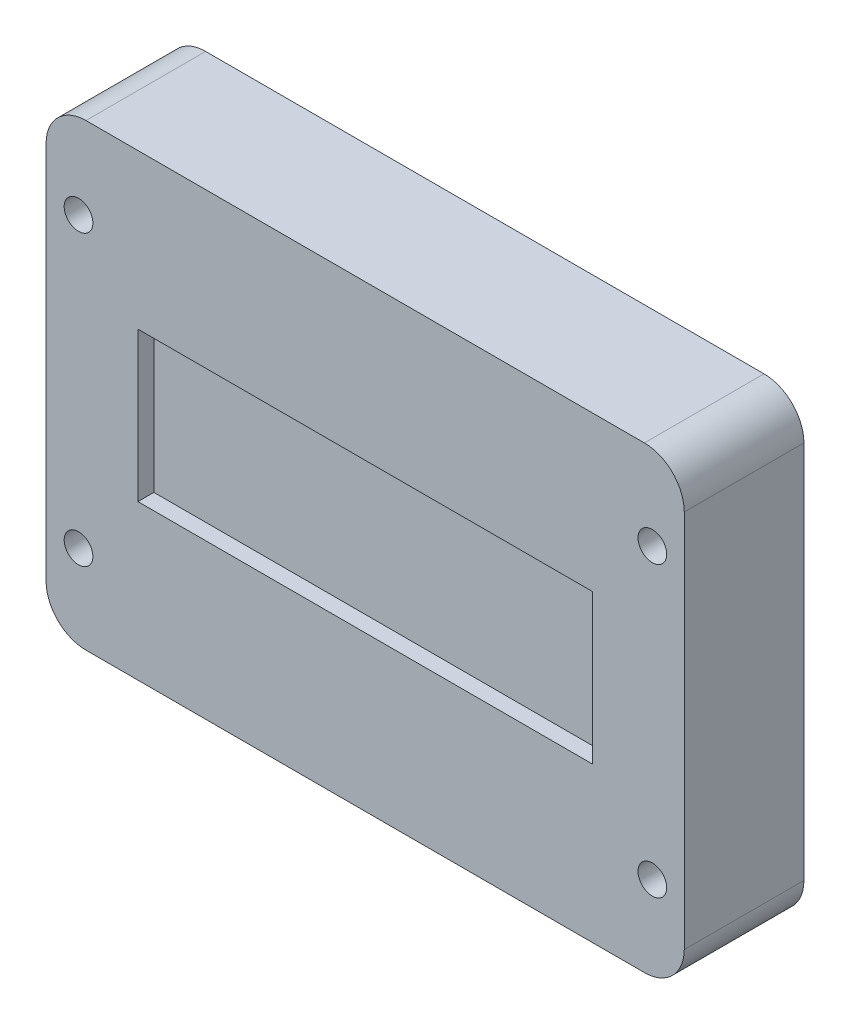
ISO-10303-21;
HEADER;
FILE_DESCRIPTION(('STEP AP214'),'2;1');
FILE_NAME('part.step','',(''),(''),'','','');
FILE_SCHEMA(('AUTOMOTIVE_DESIGN { 1 0 10303 214 1 1 1 1 }'));
ENDSEC;
DATA;
#1=APPLICATION_CONTEXT('core data for automotive mechanical design processes');
#2=APPLICATION_PROTOCOL_DEFINITION('international standard','automotive_design',2000,#1);
#3=PRODUCT_CONTEXT('',#1,'mechanical');
#4=PRODUCT('Part','Part','',(#3));
#5=PRODUCT_RELATED_PRODUCT_CATEGORY('part','',(#4));
#6=PRODUCT_DEFINITION_FORMATION('','',#4);
#7=PRODUCT_DEFINITION_CONTEXT('part definition',#1,'design');
#8=PRODUCT_DEFINITION('design','',#6,#7);
#9=PRODUCT_DEFINITION_SHAPE('','',#8);
#10=(LENGTH_UNIT() NAMED_UNIT(*) SI_UNIT(.MILLI.,.METRE.));
#11=(NAMED_UNIT(*) PLANE_ANGLE_UNIT() SI_UNIT($,.RADIAN.));
#12=(NAMED_UNIT(*) SI_UNIT($,.STERADIAN.) SOLID_ANGLE_UNIT());
#13=UNCERTAINTY_MEASURE_WITH_UNIT(LENGTH_MEASURE(1.E-05),#10,'distance_accuracy_value','');
#14=(GEOMETRIC_REPRESENTATION_CONTEXT(3) GLOBAL_UNCERTAINTY_ASSIGNED_CONTEXT((#13)) GLOBAL_UNIT_ASSIGNED_CONTEXT((#10,
#11,#12)) REPRESENTATION_CONTEXT('',''));
#15=CARTESIAN_POINT('',(0.,0.,0.));
#16=DIRECTION('',(0.,0.,1.));
#17=DIRECTION('',(1.,0.,0.));
#18=AXIS2_PLACEMENT_3D('',#15,#16,#17);
#19=CARTESIAN_POINT('',(44.45,30.1625,19.05));
#20=DIRECTION('',(0.,0.,-1.));
#21=DIRECTION('',(-1.,0.,0.));
#22=AXIS2_PLACEMENT_3D('',#19,#20,#21);
#23=PLANE('',#22);
#24=DIRECTION('',(-1.,0.,0.));
#25=VECTOR('',#24,1.);
#26=CARTESIAN_POINT('',(-36.1754446111462,11.8927769704891,19.05));
#27=LINE('',#26,#25);
#28=CARTESIAN_POINT('',(36.1754446111462,11.8927769704891,19.05));
#29=VERTEX_POINT('',#28);
#30=CARTESIAN_POINT('',(-36.1754446111462,11.8927769704891,19.05));
#31=VERTEX_POINT('',#30);
#32=EDGE_CURVE('E233',#29,#31,#27,.T.);
#33=ORIENTED_EDGE('',*,*,#32,.F.);
#34=DIRECTION('',(0.,1.,0.));
#35=VECTOR('',#34,1.);
#36=CARTESIAN_POINT('',(36.1754446111462,-11.8927769704891,19.05));
#37=LINE('',#36,#35);
#38=CARTESIAN_POINT('',(36.1754446111462,-11.8927769704891,19.05));
#39=VERTEX_POINT('',#38);
#40=EDGE_CURVE('E48',#39,#29,#37,.T.);
#41=ORIENTED_EDGE('',*,*,#40,.F.);
#42=DIRECTION('',(1.,0.,0.));
#43=VECTOR('',#42,1.);
#44=CARTESIAN_POINT('',(-36.1754446111462,-11.8927769704891,19.05));
#45=LINE('',#44,#43);
#46=CARTESIAN_POINT('',(-36.1754446111462,-11.8927769704891,19.05));
#47=VERTEX_POINT('',#46);
#48=EDGE_CURVE('E226',#47,#39,#45,.T.);
#49=ORIENTED_EDGE('',*,*,#48,.F.);
#50=DIRECTION('',(0.,-1.,0.));
#51=VECTOR('',#50,1.);
#52=CARTESIAN_POINT('',(-36.1754446111462,-11.8927769704891,19.05));
#53=LINE('',#52,#51);
#54=EDGE_CURVE('E230',#31,#47,#53,.T.);
#55=ORIENTED_EDGE('',*,*,#54,.F.);
#56=EDGE_LOOP('',(#33,#41,#49,#55));
#57=FACE_BOUND('',#56,.T.);
#58=CARTESIAN_POINT('',(45.72,-23.0505,19.05));
#59=DIRECTION('',(0.,0.,1.));
#60=DIRECTION('',(1.,0.,0.));
#61=AXIS2_PLACEMENT_3D('',#58,#59,#60);
#62=CIRCLE('',#61,2.28599999999999);
#63=CARTESIAN_POINT('',(43.434,-23.0505,19.05));
#64=VERTEX_POINT('',#63);
#65=EDGE_CURVE('E201',#64,#64,#62,.T.);
#66=ORIENTED_EDGE('',*,*,#65,.F.);
#67=EDGE_LOOP('',(#66));
#68=FACE_BOUND('',#67,.T.);
#69=CARTESIAN_POINT('',(-45.6320542440492,22.9235,19.05));
#70=DIRECTION('',(0.,0.,1.));
#71=DIRECTION('',(1.,0.,0.));
#72=AXIS2_PLACEMENT_3D('',#69,#70,#71);
#73=CIRCLE('',#72,2.28599999999999);
#74=CARTESIAN_POINT('',(-47.9180542440492,22.9235,19.05));
#75=VERTEX_POINT('',#74);
#76=EDGE_CURVE('E146',#75,#75,#73,.T.);
#77=ORIENTED_EDGE('',*,*,#76,.F.);
#78=EDGE_LOOP('',(#77));
#79=FACE_BOUND('',#78,.T.);
#80=CARTESIAN_POINT('',(44.45,30.1625,19.05));
#81=DIRECTION('',(0.,0.,1.));
#82=DIRECTION('',(-1.,0.,0.));
#83=AXIS2_PLACEMENT_3D('',#80,#81,#82);
#84=CIRCLE('',#83,6.35);
#85=CARTESIAN_POINT('',(50.8,30.1625,19.05));
#86=VERTEX_POINT('',#85);
#87=CARTESIAN_POINT('',(44.45,36.5125,19.05));
#88=VERTEX_POINT('',#87);
#89=EDGE_CURVE('E158',#86,#88,#84,.T.);
#90=ORIENTED_EDGE('',*,*,#89,.T.);
#91=DIRECTION('',(-1.,0.,0.));
#92=VECTOR('',#91,1.);
#93=CARTESIAN_POINT('',(-44.4499999999999,36.5125,19.05));
#94=LINE('',#93,#92);
#95=CARTESIAN_POINT('',(-44.4499999999999,36.5125,19.05));
#96=VERTEX_POINT('',#95);
#97=EDGE_CURVE('E98',#88,#96,#94,.T.);
#98=ORIENTED_EDGE('',*,*,#97,.T.);
#99=CARTESIAN_POINT('',(-44.45,30.1625,19.05));
#100=DIRECTION('',(0.,0.,1.));
#101=DIRECTION('',(-1.,0.,0.));
#102=AXIS2_PLACEMENT_3D('',#99,#100,#101);
#103=CIRCLE('',#102,6.35);
#104=CARTESIAN_POINT('',(-50.8,30.1625,19.05));
#105=VERTEX_POINT('',#104);
#106=EDGE_CURVE('E173',#96,#105,#103,.T.);
#107=ORIENTED_EDGE('',*,*,#106,.T.);
#108=DIRECTION('',(0.,-1.,0.));
#109=VECTOR('',#108,1.);
#110=CARTESIAN_POINT('',(-50.8,-30.1624999999999,19.05));
#111=LINE('',#110,#109);
#112=CARTESIAN_POINT('',(-50.8,-30.1624999999999,19.05));
#113=VERTEX_POINT('',#112);
#114=EDGE_CURVE('E186',#105,#113,#111,.T.);
#115=ORIENTED_EDGE('',*,*,#114,.T.);
#116=CARTESIAN_POINT('',(-44.45,-30.1625,19.05));
#117=DIRECTION('',(0.,0.,1.));
#118=DIRECTION('',(1.,0.,0.));
#119=AXIS2_PLACEMENT_3D('',#116,#117,#118);
#120=CIRCLE('',#119,6.35);
#121=CARTESIAN_POINT('',(-44.4499999999999,-36.5125,19.05));
#122=VERTEX_POINT('',#121);
#123=EDGE_CURVE('E121',#113,#122,#120,.T.);
#124=ORIENTED_EDGE('',*,*,#123,.T.);
#125=DIRECTION('',(1.,0.,0.));
#126=VECTOR('',#125,1.);
#127=CARTESIAN_POINT('',(-44.4499999999999,-36.5125,19.05));
#128=LINE('',#127,#126);
#129=CARTESIAN_POINT('',(44.45,-36.5125,19.05));
#130=VERTEX_POINT('',#129);
#131=EDGE_CURVE('E114',#122,#130,#128,.T.);
#132=ORIENTED_EDGE('',*,*,#131,.T.);
#133=CARTESIAN_POINT('',(44.45,-30.1625,19.05));
#134=DIRECTION('',(0.,0.,1.));
#135=DIRECTION('',(-1.,0.,0.));
#136=AXIS2_PLACEMENT_3D('',#133,#134,#135);
#137=CIRCLE('',#136,6.35);
#138=CARTESIAN_POINT('',(50.8,-30.1624999999999,19.05));
#139=VERTEX_POINT('',#138);
#140=EDGE_CURVE('E118',#130,#139,#137,.T.);
#141=ORIENTED_EDGE('',*,*,#140,.T.);
#142=DIRECTION('',(0.,1.,0.));
#143=VECTOR('',#142,1.);
#144=CARTESIAN_POINT('',(50.8,-30.1624999999999,19.05));
#145=LINE('',#144,#143);
#146=EDGE_CURVE('E57',#139,#86,#145,.T.);
#147=ORIENTED_EDGE('',*,*,#146,.T.);
#148=EDGE_LOOP('',(#90,#98,#107,#115,#124,#132,#141,#147));
#149=FACE_BOUND('',#148,.T.);
#150=CARTESIAN_POINT('',(45.72,22.9235,19.05));
#151=DIRECTION('',(0.,0.,1.));
#152=DIRECTION('',(1.,0.,0.));
#153=AXIS2_PLACEMENT_3D('',#150,#151,#152);
#154=CIRCLE('',#153,2.28599999999999);
#155=CARTESIAN_POINT('',(43.434,22.9235,19.05));
#156=VERTEX_POINT('',#155);
#157=EDGE_CURVE('E195',#156,#156,#154,.T.);
#158=ORIENTED_EDGE('',*,*,#157,.F.);
#159=EDGE_LOOP('',(#158));
#160=FACE_BOUND('',#159,.T.);
#161=CARTESIAN_POINT('',(-45.6320542440492,-23.0505,19.05));
#162=DIRECTION('',(0.,0.,1.));
#163=DIRECTION('',(1.,0.,0.));
#164=AXIS2_PLACEMENT_3D('',#161,#162,#163);
#165=CIRCLE('',#164,2.28599999999999);
#166=CARTESIAN_POINT('',(-47.9180542440492,-23.0505,19.05));
#167=VERTEX_POINT('',#166);
#168=EDGE_CURVE('E207',#167,#167,#165,.T.);
#169=ORIENTED_EDGE('',*,*,#168,.F.);
#170=EDGE_LOOP('',(#169));
#171=FACE_BOUND('',#170,.T.);
#172=ADVANCED_FACE('F33',(#57,#68,#79,#149,#160,#171),#23,.F.);
#173=CARTESIAN_POINT('',(44.45,30.1625,0.));
#174=DIRECTION('',(0.,0.,-1.));
#175=DIRECTION('',(-1.,0.,0.));
#176=AXIS2_PLACEMENT_3D('',#173,#174,#175);
#177=PLANE('',#176);
#178=CARTESIAN_POINT('',(45.72,-23.0505,0.));
#179=DIRECTION('',(0.,0.,1.));
#180=DIRECTION('',(1.,0.,0.));
#181=AXIS2_PLACEMENT_3D('',#178,#179,#180);
#182=CIRCLE('',#181,2.28599999999999);
#183=CARTESIAN_POINT('',(43.434,-23.0505,0.));
#184=VERTEX_POINT('',#183);
#185=EDGE_CURVE('E204',#184,#184,#182,.T.);
#186=ORIENTED_EDGE('',*,*,#185,.T.);
#187=EDGE_LOOP('',(#186));
#188=FACE_BOUND('',#187,.T.);
#189=CARTESIAN_POINT('',(-45.6320542440492,22.9235,0.));
#190=DIRECTION('',(0.,0.,1.));
#191=DIRECTION('',(1.,0.,0.));
#192=AXIS2_PLACEMENT_3D('',#189,#190,#191);
#193=CIRCLE('',#192,2.28599999999999);
#194=CARTESIAN_POINT('',(-47.9180542440492,22.9235,0.));
#195=VERTEX_POINT('',#194);
#196=EDGE_CURVE('E192',#195,#195,#193,.T.);
#197=ORIENTED_EDGE('',*,*,#196,.T.);
#198=EDGE_LOOP('',(#197));
#199=FACE_BOUND('',#198,.T.);
#200=CARTESIAN_POINT('',(44.45,30.1625,0.));
#201=DIRECTION('',(0.,0.,1.));
#202=DIRECTION('',(-1.,0.,0.));
#203=AXIS2_PLACEMENT_3D('',#200,#201,#202);
#204=CIRCLE('',#203,6.35);
#205=CARTESIAN_POINT('',(50.8,30.1625,0.));
#206=VERTEX_POINT('',#205);
#207=CARTESIAN_POINT('',(44.45,36.5125,0.));
#208=VERTEX_POINT('',#207);
#209=EDGE_CURVE('E142',#206,#208,#204,.T.);
#210=ORIENTED_EDGE('',*,*,#209,.F.);
#211=DIRECTION('',(0.,1.,0.));
#212=VECTOR('',#211,1.);
#213=CARTESIAN_POINT('',(50.8,-30.1624999999999,0.));
#214=LINE('',#213,#212);
#215=CARTESIAN_POINT('',(50.8,-30.1624999999999,0.));
#216=VERTEX_POINT('',#215);
#217=EDGE_CURVE('E90',#216,#206,#214,.T.);
#218=ORIENTED_EDGE('',*,*,#217,.F.);
#219=CARTESIAN_POINT('',(44.45,-30.1625,0.));
#220=DIRECTION('',(0.,0.,1.));
#221=DIRECTION('',(-1.,0.,0.));
#222=AXIS2_PLACEMENT_3D('',#219,#220,#221);
#223=CIRCLE('',#222,6.35);
#224=CARTESIAN_POINT('',(44.45,-36.5125,0.));
#225=VERTEX_POINT('',#224);
#226=EDGE_CURVE('E155',#225,#216,#223,.T.);
#227=ORIENTED_EDGE('',*,*,#226,.F.);
#228=DIRECTION('',(1.,0.,0.));
#229=VECTOR('',#228,1.);
#230=CARTESIAN_POINT('',(-44.4499999999999,-36.5125,0.));
#231=LINE('',#230,#229);
#232=CARTESIAN_POINT('',(-44.4499999999999,-36.5125,0.));
#233=VERTEX_POINT('',#232);
#234=EDGE_CURVE('E130',#233,#225,#231,.T.);
#235=ORIENTED_EDGE('',*,*,#234,.F.);
#236=CARTESIAN_POINT('',(-44.45,-30.1625,0.));
#237=DIRECTION('',(0.,0.,1.));
#238=DIRECTION('',(1.,0.,0.));
#239=AXIS2_PLACEMENT_3D('',#236,#237,#238);
#240=CIRCLE('',#239,6.35);
#241=CARTESIAN_POINT('',(-50.8,-30.1624999999999,0.));
#242=VERTEX_POINT('',#241);
#243=EDGE_CURVE('E152',#242,#233,#240,.T.);
#244=ORIENTED_EDGE('',*,*,#243,.F.);
#245=DIRECTION('',(0.,-1.,0.));
#246=VECTOR('',#245,1.);
#247=CARTESIAN_POINT('',(-50.8,-30.1624999999999,0.));
#248=LINE('',#247,#246);
#249=CARTESIAN_POINT('',(-50.8,30.1625,0.));
#250=VERTEX_POINT('',#249);
#251=EDGE_CURVE('E150',#250,#242,#248,.T.);
#252=ORIENTED_EDGE('',*,*,#251,.F.);
#253=CARTESIAN_POINT('',(-44.45,30.1625,0.));
#254=DIRECTION('',(0.,0.,1.));
#255=DIRECTION('',(-1.,0.,0.));
#256=AXIS2_PLACEMENT_3D('',#253,#254,#255);
#257=CIRCLE('',#256,6.35);
#258=CARTESIAN_POINT('',(-44.4499999999999,36.5125,0.));
#259=VERTEX_POINT('',#258);
#260=EDGE_CURVE('E148',#259,#250,#257,.T.);
#261=ORIENTED_EDGE('',*,*,#260,.F.);
#262=DIRECTION('',(-1.,0.,0.));
#263=VECTOR('',#262,1.);
#264=CARTESIAN_POINT('',(-44.4499999999999,36.5125,0.));
#265=LINE('',#264,#263);
#266=EDGE_CURVE('E145',#208,#259,#265,.T.);
#267=ORIENTED_EDGE('',*,*,#266,.F.);
#268=EDGE_LOOP('',(#210,#218,#227,#235,#244,#252,#261,#267));
#269=FACE_BOUND('',#268,.T.);
#270=CARTESIAN_POINT('',(45.72,22.9235,0.));
#271=DIRECTION('',(0.,0.,1.));
#272=DIRECTION('',(1.,0.,0.));
#273=AXIS2_PLACEMENT_3D('',#270,#271,#272);
#274=CIRCLE('',#273,2.28599999999999);
#275=CARTESIAN_POINT('',(43.434,22.9235,0.));
#276=VERTEX_POINT('',#275);
#277=EDGE_CURVE('E198',#276,#276,#274,.T.);
#278=ORIENTED_EDGE('',*,*,#277,.T.);
#279=EDGE_LOOP('',(#278));
#280=FACE_BOUND('',#279,.T.);
#281=CARTESIAN_POINT('',(-45.6320542440492,-23.0505,0.));
#282=DIRECTION('',(0.,0.,1.));
#283=DIRECTION('',(1.,0.,0.));
#284=AXIS2_PLACEMENT_3D('',#281,#282,#283);
#285=CIRCLE('',#284,2.28599999999999);
#286=CARTESIAN_POINT('',(-47.9180542440492,-23.0505,0.));
#287=VERTEX_POINT('',#286);
#288=EDGE_CURVE('E210',#287,#287,#285,.T.);
#289=ORIENTED_EDGE('',*,*,#288,.T.);
#290=EDGE_LOOP('',(#289));
#291=FACE_BOUND('',#290,.T.);
#292=ADVANCED_FACE('F177',(#188,#199,#269,#280,#291),#177,.T.);
#293=CARTESIAN_POINT('',(44.45,30.1625,19.05));
#294=DIRECTION('',(0.,0.,-1.));
#295=DIRECTION('',(-1.,0.,0.));
#296=AXIS2_PLACEMENT_3D('',#293,#294,#295);
#297=CYLINDRICAL_SURFACE('',#296,6.35);
#298=ORIENTED_EDGE('',*,*,#209,.T.);
#299=DIRECTION('',(0.,0.,-1.));
#300=VECTOR('',#299,1.);
#301=CARTESIAN_POINT('',(44.45,36.5125,19.05));
#302=LINE('',#301,#300);
#303=EDGE_CURVE('E11',#88,#208,#302,.T.);
#304=ORIENTED_EDGE('',*,*,#303,.F.);
#305=ORIENTED_EDGE('',*,*,#89,.F.);
#306=DIRECTION('',(0.,0.,-1.));
#307=VECTOR('',#306,1.);
#308=CARTESIAN_POINT('',(50.8,30.1625,19.05));
#309=LINE('',#308,#307);
#310=EDGE_CURVE('E138',#86,#206,#309,.T.);
#311=ORIENTED_EDGE('',*,*,#310,.T.);
#312=EDGE_LOOP('',(#298,#304,#305,#311));
#313=FACE_BOUND('',#312,.T.);
#314=ADVANCED_FACE('F35',(#313),#297,.T.);
#315=CARTESIAN_POINT('',(-44.4499999999999,36.5125,19.05));
#316=DIRECTION('',(0.,-1.,0.));
#317=DIRECTION('',(0.,0.,-1.));
#318=AXIS2_PLACEMENT_3D('',#315,#316,#317);
#319=PLANE('',#318);
#320=ORIENTED_EDGE('',*,*,#266,.T.);
#321=DIRECTION('',(0.,0.,-1.));
#322=VECTOR('',#321,1.);
#323=CARTESIAN_POINT('',(-44.4499999999999,36.5125,19.05));
#324=LINE('',#323,#322);
#325=EDGE_CURVE('E41',#96,#259,#324,.T.);
#326=ORIENTED_EDGE('',*,*,#325,.F.);
#327=ORIENTED_EDGE('',*,*,#97,.F.);
#328=ORIENTED_EDGE('',*,*,#303,.T.);
#329=EDGE_LOOP('',(#320,#326,#327,#328));
#330=FACE_BOUND('',#329,.T.);
#331=ADVANCED_FACE('F311',(#330),#319,.F.);
#332=CARTESIAN_POINT('',(-44.45,30.1625,19.05));
#333=DIRECTION('',(0.,0.,-1.));
#334=DIRECTION('',(-1.,0.,0.));
#335=AXIS2_PLACEMENT_3D('',#332,#333,#334);
#336=CYLINDRICAL_SURFACE('',#335,6.35);
#337=ORIENTED_EDGE('',*,*,#260,.T.);
#338=DIRECTION('',(0.,0.,-1.));
#339=VECTOR('',#338,1.);
#340=CARTESIAN_POINT('',(-50.8,30.1625,19.05));
#341=LINE('',#340,#339);
#342=EDGE_CURVE('E165',#105,#250,#341,.T.);
#343=ORIENTED_EDGE('',*,*,#342,.F.);
#344=ORIENTED_EDGE('',*,*,#106,.F.);
#345=ORIENTED_EDGE('',*,*,#325,.T.);
#346=EDGE_LOOP('',(#337,#343,#344,#345));
#347=FACE_BOUND('',#346,.T.);
#348=ADVANCED_FACE('F171',(#347),#336,.T.);
#349=CARTESIAN_POINT('',(-50.8,-30.1624999999999,19.05));
#350=DIRECTION('',(1.,0.,0.));
#351=DIRECTION('',(0.,0.,-1.));
#352=AXIS2_PLACEMENT_3D('',#349,#350,#351);
#353=PLANE('',#352);
#354=ORIENTED_EDGE('',*,*,#251,.T.);
#355=DIRECTION('',(0.,0.,-1.));
#356=VECTOR('',#355,1.);
#357=CARTESIAN_POINT('',(-50.8,-30.1624999999999,19.05));
#358=LINE('',#357,#356);
#359=EDGE_CURVE('E162',#113,#242,#358,.T.);
#360=ORIENTED_EDGE('',*,*,#359,.F.);
#361=ORIENTED_EDGE('',*,*,#114,.F.);
#362=ORIENTED_EDGE('',*,*,#342,.T.);
#363=EDGE_LOOP('',(#354,#360,#361,#362));
#364=FACE_BOUND('',#363,.T.);
#365=ADVANCED_FACE('F182',(#364),#353,.F.);
#366=CARTESIAN_POINT('',(-44.45,-30.1625,19.05));
#367=DIRECTION('',(0.,0.,-1.));
#368=DIRECTION('',(-1.,0.,0.));
#369=AXIS2_PLACEMENT_3D('',#366,#367,#368);
#370=CYLINDRICAL_SURFACE('',#369,6.35);
#371=ORIENTED_EDGE('',*,*,#243,.T.);
#372=DIRECTION('',(0.,0.,-1.));
#373=VECTOR('',#372,1.);
#374=CARTESIAN_POINT('',(-44.4499999999999,-36.5125,19.05));
#375=LINE('',#374,#373);
#376=EDGE_CURVE('E133',#122,#233,#375,.T.);
#377=ORIENTED_EDGE('',*,*,#376,.F.);
#378=ORIENTED_EDGE('',*,*,#123,.F.);
#379=ORIENTED_EDGE('',*,*,#359,.T.);
#380=EDGE_LOOP('',(#371,#377,#378,#379));
#381=FACE_BOUND('',#380,.T.);
#382=ADVANCED_FACE('F185',(#381),#370,.T.);
#383=CARTESIAN_POINT('',(-44.4499999999999,-36.5125,19.05));
#384=DIRECTION('',(0.,1.,0.));
#385=DIRECTION('',(0.,0.,1.));
#386=AXIS2_PLACEMENT_3D('',#383,#384,#385);
#387=PLANE('',#386);
#388=ORIENTED_EDGE('',*,*,#234,.T.);
#389=DIRECTION('',(0.,0.,-1.));
#390=VECTOR('',#389,1.);
#391=CARTESIAN_POINT('',(44.45,-36.5125,19.05));
#392=LINE('',#391,#390);
#393=EDGE_CURVE('E127',#130,#225,#392,.T.);
#394=ORIENTED_EDGE('',*,*,#393,.F.);
#395=ORIENTED_EDGE('',*,*,#131,.F.);
#396=ORIENTED_EDGE('',*,*,#376,.T.);
#397=EDGE_LOOP('',(#388,#394,#395,#396));
#398=FACE_BOUND('',#397,.T.);
#399=ADVANCED_FACE('F128',(#398),#387,.F.);
#400=CARTESIAN_POINT('',(44.45,-30.1625,19.05));
#401=DIRECTION('',(0.,0.,-1.));
#402=DIRECTION('',(-1.,0.,0.));
#403=AXIS2_PLACEMENT_3D('',#400,#401,#402);
#404=CYLINDRICAL_SURFACE('',#403,6.35);
#405=ORIENTED_EDGE('',*,*,#226,.T.);
#406=DIRECTION('',(0.,0.,-1.));
#407=VECTOR('',#406,1.);
#408=CARTESIAN_POINT('',(50.8,-30.1624999999999,19.05));
#409=LINE('',#408,#407);
#410=EDGE_CURVE('E134',#139,#216,#409,.T.);
#411=ORIENTED_EDGE('',*,*,#410,.F.);
#412=ORIENTED_EDGE('',*,*,#140,.F.);
#413=ORIENTED_EDGE('',*,*,#393,.T.);
#414=EDGE_LOOP('',(#405,#411,#412,#413));
#415=FACE_BOUND('',#414,.T.);
#416=ADVANCED_FACE('F136',(#415),#404,.T.);
#417=CARTESIAN_POINT('',(50.8,-30.1624999999999,19.05));
#418=DIRECTION('',(-1.,0.,0.));
#419=DIRECTION('',(0.,0.,1.));
#420=AXIS2_PLACEMENT_3D('',#417,#418,#419);
#421=PLANE('',#420);
#422=ORIENTED_EDGE('',*,*,#217,.T.);
#423=ORIENTED_EDGE('',*,*,#310,.F.);
#424=ORIENTED_EDGE('',*,*,#146,.F.);
#425=ORIENTED_EDGE('',*,*,#410,.T.);
#426=EDGE_LOOP('',(#422,#423,#424,#425));
#427=FACE_BOUND('',#426,.T.);
#428=ADVANCED_FACE('F299',(#427),#421,.F.);
#429=CARTESIAN_POINT('',(-45.6320542440492,22.9235,19.05));
#430=DIRECTION('',(0.,0.,-1.));
#431=DIRECTION('',(-1.,0.,0.));
#432=AXIS2_PLACEMENT_3D('',#429,#430,#431);
#433=CYLINDRICAL_SURFACE('',#432,2.28599999999999);
#434=CARTESIAN_POINT('',(-47.9180542440492,22.9235,19.05));
#435=CARTESIAN_POINT('',(-47.9180542440492,22.9235,18.8515625));
#436=CARTESIAN_POINT('',(-47.9180542440492,22.9235,18.653125));
#437=CARTESIAN_POINT('',(-47.9180542440492,22.9235,18.25625));
#438=CARTESIAN_POINT('',(-47.9180542440492,22.9235,18.0578125));
#439=CARTESIAN_POINT('',(-47.9180542440492,22.9235,17.6609375));
#440=CARTESIAN_POINT('',(-47.9180542440492,22.9235,17.4625));
#441=CARTESIAN_POINT('',(-47.9180542440492,22.9235,17.065625));
#442=CARTESIAN_POINT('',(-47.9180542440492,22.9235,16.8671875));
#443=CARTESIAN_POINT('',(-47.9180542440492,22.9235,16.4703125));
#444=CARTESIAN_POINT('',(-47.9180542440492,22.9235,16.271875));
#445=CARTESIAN_POINT('',(-47.9180542440492,22.9235,15.875));
#446=CARTESIAN_POINT('',(-47.9180542440492,22.9235,15.6765625));
#447=CARTESIAN_POINT('',(-47.9180542440492,22.9235,15.2796875));
#448=CARTESIAN_POINT('',(-47.9180542440492,22.9235,15.08125));
#449=CARTESIAN_POINT('',(-47.9180542440492,22.9235,14.684375));
#450=CARTESIAN_POINT('',(-47.9180542440492,22.9235,14.4859375));
#451=CARTESIAN_POINT('',(-47.9180542440492,22.9235,14.0890625));
#452=CARTESIAN_POINT('',(-47.9180542440492,22.9235,13.890625));
#453=CARTESIAN_POINT('',(-47.9180542440492,22.9235,13.49375));
#454=CARTESIAN_POINT('',(-47.9180542440492,22.9235,13.2953125));
#455=CARTESIAN_POINT('',(-47.9180542440492,22.9235,12.8984375));
#456=CARTESIAN_POINT('',(-47.9180542440492,22.9235,12.7));
#457=CARTESIAN_POINT('',(-47.9180542440492,22.9235,12.303125));
#458=CARTESIAN_POINT('',(-47.9180542440492,22.9235,12.1046875));
#459=CARTESIAN_POINT('',(-47.9180542440492,22.9235,11.7078125));
#460=CARTESIAN_POINT('',(-47.9180542440492,22.9235,11.509375));
#461=CARTESIAN_POINT('',(-47.9180542440492,22.9235,11.1125));
#462=CARTESIAN_POINT('',(-47.9180542440492,22.9235,10.9140625));
#463=CARTESIAN_POINT('',(-47.9180542440492,22.9235,10.5171875));
#464=CARTESIAN_POINT('',(-47.9180542440492,22.9235,10.31875));
#465=CARTESIAN_POINT('',(-47.9180542440492,22.9235,9.921875));
#466=CARTESIAN_POINT('',(-47.9180542440492,22.9235,9.7234375));
#467=CARTESIAN_POINT('',(-47.9180542440492,22.9235,9.3265625));
#468=CARTESIAN_POINT('',(-47.9180542440492,22.9235,9.128125));
#469=CARTESIAN_POINT('',(-47.9180542440492,22.9235,8.73125));
#470=CARTESIAN_POINT('',(-47.9180542440492,22.9235,8.5328125));
#471=CARTESIAN_POINT('',(-47.9180542440492,22.9235,8.1359375));
#472=CARTESIAN_POINT('',(-47.9180542440492,22.9235,7.9375));
#473=CARTESIAN_POINT('',(-47.9180542440492,22.9235,7.540625));
#474=CARTESIAN_POINT('',(-47.9180542440492,22.9235,7.3421875));
#475=CARTESIAN_POINT('',(-47.9180542440492,22.9235,6.9453125));
#476=CARTESIAN_POINT('',(-47.9180542440492,22.9235,6.746875));
#477=CARTESIAN_POINT('',(-47.9180542440492,22.9235,6.35));
#478=CARTESIAN_POINT('',(-47.9180542440492,22.9235,6.1515625));
#479=CARTESIAN_POINT('',(-47.9180542440492,22.9235,5.7546875));
#480=CARTESIAN_POINT('',(-47.9180542440492,22.9235,5.55625));
#481=CARTESIAN_POINT('',(-47.9180542440492,22.9235,5.159375));
#482=CARTESIAN_POINT('',(-47.9180542440492,22.9235,4.9609375));
#483=CARTESIAN_POINT('',(-47.9180542440492,22.9235,4.5640625));
#484=CARTESIAN_POINT('',(-47.9180542440492,22.9235,4.365625));
#485=CARTESIAN_POINT('',(-47.9180542440492,22.9235,3.96875));
#486=CARTESIAN_POINT('',(-47.9180542440492,22.9235,3.7703125));
#487=CARTESIAN_POINT('',(-47.9180542440492,22.9235,3.3734375));
#488=CARTESIAN_POINT('',(-47.9180542440492,22.9235,3.175));
#489=CARTESIAN_POINT('',(-47.9180542440492,22.9235,2.778125));
#490=CARTESIAN_POINT('',(-47.9180542440492,22.9235,2.5796875));
#491=CARTESIAN_POINT('',(-47.9180542440492,22.9235,2.1828125));
#492=CARTESIAN_POINT('',(-47.9180542440492,22.9235,1.984375));
#493=CARTESIAN_POINT('',(-47.9180542440492,22.9235,1.5875));
#494=CARTESIAN_POINT('',(-47.9180542440492,22.9235,1.3890625));
#495=CARTESIAN_POINT('',(-47.9180542440492,22.9235,0.992187500000001));
#496=CARTESIAN_POINT('',(-47.9180542440492,22.9235,0.793750000000001));
#497=CARTESIAN_POINT('',(-47.9180542440492,22.9235,0.396875));
#498=CARTESIAN_POINT('',(-47.9180542440492,22.9235,0.1984375));
#499=CARTESIAN_POINT('',(-47.9180542440492,22.9235,0.));
#500=B_SPLINE_CURVE_WITH_KNOTS('',3,(#434,#435,#436,#437,#438,#439,#440,#441,#442,#443,#444,
#445,#446,#447,#448,#449,#450,#451,#452,#453,#454,#455,#456,#457,#458,#459,#460,#461,#462,#463,
#464,#465,#466,#467,#468,#469,#470,#471,#472,#473,#474,#475,#476,#477,#478,#479,#480,#481,#482,
#483,#484,#485,#486,#487,#488,#489,#490,#491,#492,#493,#494,#495,#496,#497,#498,#499),
.UNSPECIFIED.,.F.,.F.,(4,2,2,2,2,2,2,2,2,2,2,2,2,2,2,2,2,2,2,2,2,2,2,2,2,2,2,2,2,2,2,2,4),(0.,
0.5953125,1.190625,1.7859375,2.38125,2.9765625,3.571875,4.1671875,4.7625,5.3578125,5.953125,
6.5484375,7.14375,7.7390625,8.334375,8.9296875,9.525,10.1203125,10.715625,11.3109375,11.90625,
12.5015625,13.096875,13.6921875,14.2875,14.8828125,15.478125,16.0734375,16.66875,17.2640625,
17.859375,18.4546875,19.05),.UNSPECIFIED.);
#501=EDGE_CURVE('BSEAM296',#75,#195,#500,.T.);
#502=ORIENTED_EDGE('',*,*,#76,.T.);
#503=ORIENTED_EDGE('',*,*,#196,.F.);
#504=ORIENTED_EDGE('',*,*,#501,.T.);
#505=ORIENTED_EDGE('',*,*,#501,.F.);
#506=EDGE_LOOP('',(#502,#504,#503,#505));
#507=FACE_BOUND('',#506,.T.);
#508=ADVANCED_FACE('F296',(#507),#433,.F.);
#509=CARTESIAN_POINT('',(45.72,22.9235,19.05));
#510=DIRECTION('',(0.,0.,-1.));
#511=DIRECTION('',(-1.,0.,0.));
#512=AXIS2_PLACEMENT_3D('',#509,#510,#511);
#513=CYLINDRICAL_SURFACE('',#512,2.28599999999999);
#514=CARTESIAN_POINT('',(43.434,22.9235,19.05));
#515=CARTESIAN_POINT('',(43.434,22.9235,18.8515625));
#516=CARTESIAN_POINT('',(43.434,22.9235,18.653125));
#517=CARTESIAN_POINT('',(43.434,22.9235,18.25625));
#518=CARTESIAN_POINT('',(43.434,22.9235,18.0578125));
#519=CARTESIAN_POINT('',(43.434,22.9235,17.6609375));
#520=CARTESIAN_POINT('',(43.434,22.9235,17.4625));
#521=CARTESIAN_POINT('',(43.434,22.9235,17.065625));
#522=CARTESIAN_POINT('',(43.434,22.9235,16.8671875));
#523=CARTESIAN_POINT('',(43.434,22.9235,16.4703125));
#524=CARTESIAN_POINT('',(43.434,22.9235,16.271875));
#525=CARTESIAN_POINT('',(43.434,22.9235,15.875));
#526=CARTESIAN_POINT('',(43.434,22.9235,15.6765625));
#527=CARTESIAN_POINT('',(43.434,22.9235,15.2796875));
#528=CARTESIAN_POINT('',(43.434,22.9235,15.08125));
#529=CARTESIAN_POINT('',(43.434,22.9235,14.684375));
#530=CARTESIAN_POINT('',(43.434,22.9235,14.4859375));
#531=CARTESIAN_POINT('',(43.434,22.9235,14.0890625));
#532=CARTESIAN_POINT('',(43.434,22.9235,13.890625));
#533=CARTESIAN_POINT('',(43.434,22.9235,13.49375));
#534=CARTESIAN_POINT('',(43.434,22.9235,13.2953125));
#535=CARTESIAN_POINT('',(43.434,22.9235,12.8984375));
#536=CARTESIAN_POINT('',(43.434,22.9235,12.7));
#537=CARTESIAN_POINT('',(43.434,22.9235,12.303125));
#538=CARTESIAN_POINT('',(43.434,22.9235,12.1046875));
#539=CARTESIAN_POINT('',(43.434,22.9235,11.7078125));
#540=CARTESIAN_POINT('',(43.434,22.9235,11.509375));
#541=CARTESIAN_POINT('',(43.434,22.9235,11.1125));
#542=CARTESIAN_POINT('',(43.434,22.9235,10.9140625));
#543=CARTESIAN_POINT('',(43.434,22.9235,10.5171875));
#544=CARTESIAN_POINT('',(43.434,22.9235,10.31875));
#545=CARTESIAN_POINT('',(43.434,22.9235,9.921875));
#546=CARTESIAN_POINT('',(43.434,22.9235,9.7234375));
#547=CARTESIAN_POINT('',(43.434,22.9235,9.3265625));
#548=CARTESIAN_POINT('',(43.434,22.9235,9.128125));
#549=CARTESIAN_POINT('',(43.434,22.9235,8.73125));
#550=CARTESIAN_POINT('',(43.434,22.9235,8.5328125));
#551=CARTESIAN_POINT('',(43.434,22.9235,8.1359375));
#552=CARTESIAN_POINT('',(43.434,22.9235,7.9375));
#553=CARTESIAN_POINT('',(43.434,22.9235,7.540625));
#554=CARTESIAN_POINT('',(43.434,22.9235,7.3421875));
#555=CARTESIAN_POINT('',(43.434,22.9235,6.9453125));
#556=CARTESIAN_POINT('',(43.434,22.9235,6.746875));
#557=CARTESIAN_POINT('',(43.434,22.9235,6.35));
#558=CARTESIAN_POINT('',(43.434,22.9235,6.1515625));
#559=CARTESIAN_POINT('',(43.434,22.9235,5.7546875));
#560=CARTESIAN_POINT('',(43.434,22.9235,5.55625));
#561=CARTESIAN_POINT('',(43.434,22.9235,5.159375));
#562=CARTESIAN_POINT('',(43.434,22.9235,4.9609375));
#563=CARTESIAN_POINT('',(43.434,22.9235,4.5640625));
#564=CARTESIAN_POINT('',(43.434,22.9235,4.365625));
#565=CARTESIAN_POINT('',(43.434,22.9235,3.96875));
#566=CARTESIAN_POINT('',(43.434,22.9235,3.7703125));
#567=CARTESIAN_POINT('',(43.434,22.9235,3.3734375));
#568=CARTESIAN_POINT('',(43.434,22.9235,3.175));
#569=CARTESIAN_POINT('',(43.434,22.9235,2.778125));
#570=CARTESIAN_POINT('',(43.434,22.9235,2.5796875));
#571=CARTESIAN_POINT('',(43.434,22.9235,2.1828125));
#572=CARTESIAN_POINT('',(43.434,22.9235,1.984375));
#573=CARTESIAN_POINT('',(43.434,22.9235,1.5875));
#574=CARTESIAN_POINT('',(43.434,22.9235,1.3890625));
#575=CARTESIAN_POINT('',(43.434,22.9235,0.992187500000001));
#576=CARTESIAN_POINT('',(43.434,22.9235,0.793750000000001));
#577=CARTESIAN_POINT('',(43.434,22.9235,0.396875));
#578=CARTESIAN_POINT('',(43.434,22.9235,0.1984375));
#579=CARTESIAN_POINT('',(43.434,22.9235,0.));
#580=B_SPLINE_CURVE_WITH_KNOTS('',3,(#514,#515,#516,#517,#518,#519,#520,#521,#522,#523,#524,
#525,#526,#527,#528,#529,#530,#531,#532,#533,#534,#535,#536,#537,#538,#539,#540,#541,#542,#543,
#544,#545,#546,#547,#548,#549,#550,#551,#552,#553,#554,#555,#556,#557,#558,#559,#560,#561,#562,
#563,#564,#565,#566,#567,#568,#569,#570,#571,#572,#573,#574,#575,#576,#577,#578,#579),
.UNSPECIFIED.,.F.,.F.,(4,2,2,2,2,2,2,2,2,2,2,2,2,2,2,2,2,2,2,2,2,2,2,2,2,2,2,2,2,2,2,2,4),(0.,
0.5953125,1.190625,1.7859375,2.38125,2.9765625,3.571875,4.1671875,4.7625,5.3578125,5.953125,
6.5484375,7.14375,7.7390625,8.334375,8.9296875,9.525,10.1203125,10.715625,11.3109375,11.90625,
12.5015625,13.096875,13.6921875,14.2875,14.8828125,15.478125,16.0734375,16.66875,17.2640625,
17.859375,18.4546875,19.05),.UNSPECIFIED.);
#581=EDGE_CURVE('BSEAM375',#156,#276,#580,.T.);
#582=ORIENTED_EDGE('',*,*,#157,.T.);
#583=ORIENTED_EDGE('',*,*,#277,.F.);
#584=ORIENTED_EDGE('',*,*,#581,.T.);
#585=ORIENTED_EDGE('',*,*,#581,.F.);
#586=EDGE_LOOP('',(#582,#584,#583,#585));
#587=FACE_BOUND('',#586,.T.);
#588=ADVANCED_FACE('F375',(#587),#513,.F.);
#589=CARTESIAN_POINT('',(45.72,-23.0505,19.05));
#590=DIRECTION('',(0.,0.,-1.));
#591=DIRECTION('',(-1.,0.,0.));
#592=AXIS2_PLACEMENT_3D('',#589,#590,#591);
#593=CYLINDRICAL_SURFACE('',#592,2.28599999999999);
#594=CARTESIAN_POINT('',(43.434,-23.0505,19.05));
#595=CARTESIAN_POINT('',(43.434,-23.0505,18.8515625));
#596=CARTESIAN_POINT('',(43.434,-23.0505,18.653125));
#597=CARTESIAN_POINT('',(43.434,-23.0505,18.25625));
#598=CARTESIAN_POINT('',(43.434,-23.0505,18.0578125));
#599=CARTESIAN_POINT('',(43.434,-23.0505,17.6609375));
#600=CARTESIAN_POINT('',(43.434,-23.0505,17.4625));
#601=CARTESIAN_POINT('',(43.434,-23.0505,17.065625));
#602=CARTESIAN_POINT('',(43.434,-23.0505,16.8671875));
#603=CARTESIAN_POINT('',(43.434,-23.0505,16.4703125));
#604=CARTESIAN_POINT('',(43.434,-23.0505,16.271875));
#605=CARTESIAN_POINT('',(43.434,-23.0505,15.875));
#606=CARTESIAN_POINT('',(43.434,-23.0505,15.6765625));
#607=CARTESIAN_POINT('',(43.434,-23.0505,15.2796875));
#608=CARTESIAN_POINT('',(43.434,-23.0505,15.08125));
#609=CARTESIAN_POINT('',(43.434,-23.0505,14.684375));
#610=CARTESIAN_POINT('',(43.434,-23.0505,14.4859375));
#611=CARTESIAN_POINT('',(43.434,-23.0505,14.0890625));
#612=CARTESIAN_POINT('',(43.434,-23.0505,13.890625));
#613=CARTESIAN_POINT('',(43.434,-23.0505,13.49375));
#614=CARTESIAN_POINT('',(43.434,-23.0505,13.2953125));
#615=CARTESIAN_POINT('',(43.434,-23.0505,12.8984375));
#616=CARTESIAN_POINT('',(43.434,-23.0505,12.7));
#617=CARTESIAN_POINT('',(43.434,-23.0505,12.303125));
#618=CARTESIAN_POINT('',(43.434,-23.0505,12.1046875));
#619=CARTESIAN_POINT('',(43.434,-23.0505,11.7078125));
#620=CARTESIAN_POINT('',(43.434,-23.0505,11.509375));
#621=CARTESIAN_POINT('',(43.434,-23.0505,11.1125));
#622=CARTESIAN_POINT('',(43.434,-23.0505,10.9140625));
#623=CARTESIAN_POINT('',(43.434,-23.0505,10.5171875));
#624=CARTESIAN_POINT('',(43.434,-23.0505,10.31875));
#625=CARTESIAN_POINT('',(43.434,-23.0505,9.921875));
#626=CARTESIAN_POINT('',(43.434,-23.0505,9.7234375));
#627=CARTESIAN_POINT('',(43.434,-23.0505,9.3265625));
#628=CARTESIAN_POINT('',(43.434,-23.0505,9.128125));
#629=CARTESIAN_POINT('',(43.434,-23.0505,8.73125));
#630=CARTESIAN_POINT('',(43.434,-23.0505,8.5328125));
#631=CARTESIAN_POINT('',(43.434,-23.0505,8.1359375));
#632=CARTESIAN_POINT('',(43.434,-23.0505,7.9375));
#633=CARTESIAN_POINT('',(43.434,-23.0505,7.540625));
#634=CARTESIAN_POINT('',(43.434,-23.0505,7.3421875));
#635=CARTESIAN_POINT('',(43.434,-23.0505,6.9453125));
#636=CARTESIAN_POINT('',(43.434,-23.0505,6.746875));
#637=CARTESIAN_POINT('',(43.434,-23.0505,6.35));
#638=CARTESIAN_POINT('',(43.434,-23.0505,6.1515625));
#639=CARTESIAN_POINT('',(43.434,-23.0505,5.7546875));
#640=CARTESIAN_POINT('',(43.434,-23.0505,5.55625));
#641=CARTESIAN_POINT('',(43.434,-23.0505,5.159375));
#642=CARTESIAN_POINT('',(43.434,-23.0505,4.9609375));
#643=CARTESIAN_POINT('',(43.434,-23.0505,4.5640625));
#644=CARTESIAN_POINT('',(43.434,-23.0505,4.365625));
#645=CARTESIAN_POINT('',(43.434,-23.0505,3.96875));
#646=CARTESIAN_POINT('',(43.434,-23.0505,3.7703125));
#647=CARTESIAN_POINT('',(43.434,-23.0505,3.3734375));
#648=CARTESIAN_POINT('',(43.434,-23.0505,3.175));
#649=CARTESIAN_POINT('',(43.434,-23.0505,2.778125));
#650=CARTESIAN_POINT('',(43.434,-23.0505,2.5796875));
#651=CARTESIAN_POINT('',(43.434,-23.0505,2.1828125));
#652=CARTESIAN_POINT('',(43.434,-23.0505,1.984375));
#653=CARTESIAN_POINT('',(43.434,-23.0505,1.5875));
#654=CARTESIAN_POINT('',(43.434,-23.0505,1.3890625));
#655=CARTESIAN_POINT('',(43.434,-23.0505,0.992187500000001));
#656=CARTESIAN_POINT('',(43.434,-23.0505,0.793750000000001));
#657=CARTESIAN_POINT('',(43.434,-23.0505,0.396875));
#658=CARTESIAN_POINT('',(43.434,-23.0505,0.1984375));
#659=CARTESIAN_POINT('',(43.434,-23.0505,0.));
#660=B_SPLINE_CURVE_WITH_KNOTS('',3,(#594,#595,#596,#597,#598,#599,#600,#601,#602,#603,#604,
#605,#606,#607,#608,#609,#610,#611,#612,#613,#614,#615,#616,#617,#618,#619,#620,#621,#622,#623,
#624,#625,#626,#627,#628,#629,#630,#631,#632,#633,#634,#635,#636,#637,#638,#639,#640,#641,#642,
#643,#644,#645,#646,#647,#648,#649,#650,#651,#652,#653,#654,#655,#656,#657,#658,#659),
.UNSPECIFIED.,.F.,.F.,(4,2,2,2,2,2,2,2,2,2,2,2,2,2,2,2,2,2,2,2,2,2,2,2,2,2,2,2,2,2,2,2,4),(0.,
0.5953125,1.190625,1.7859375,2.38125,2.9765625,3.571875,4.1671875,4.7625,5.3578125,5.953125,
6.5484375,7.14375,7.7390625,8.334375,8.9296875,9.525,10.1203125,10.715625,11.3109375,11.90625,
12.5015625,13.096875,13.6921875,14.2875,14.8828125,15.478125,16.0734375,16.66875,17.2640625,
17.859375,18.4546875,19.05),.UNSPECIFIED.);
#661=EDGE_CURVE('BSEAM383',#64,#184,#660,.T.);
#662=ORIENTED_EDGE('',*,*,#65,.T.);
#663=ORIENTED_EDGE('',*,*,#185,.F.);
#664=ORIENTED_EDGE('',*,*,#661,.T.);
#665=ORIENTED_EDGE('',*,*,#661,.F.);
#666=EDGE_LOOP('',(#662,#664,#663,#665));
#667=FACE_BOUND('',#666,.T.);
#668=ADVANCED_FACE('F383',(#667),#593,.F.);
#669=CARTESIAN_POINT('',(-45.6320542440492,-23.0505,19.05));
#670=DIRECTION('',(0.,0.,-1.));
#671=DIRECTION('',(-1.,0.,0.));
#672=AXIS2_PLACEMENT_3D('',#669,#670,#671);
#673=CYLINDRICAL_SURFACE('',#672,2.28599999999999);
#674=CARTESIAN_POINT('',(-47.9180542440492,-23.0505,19.05));
#675=CARTESIAN_POINT('',(-47.9180542440492,-23.0505,18.8515625));
#676=CARTESIAN_POINT('',(-47.9180542440492,-23.0505,18.653125));
#677=CARTESIAN_POINT('',(-47.9180542440492,-23.0505,18.25625));
#678=CARTESIAN_POINT('',(-47.9180542440492,-23.0505,18.0578125));
#679=CARTESIAN_POINT('',(-47.9180542440492,-23.0505,17.6609375));
#680=CARTESIAN_POINT('',(-47.9180542440492,-23.0505,17.4625));
#681=CARTESIAN_POINT('',(-47.9180542440492,-23.0505,17.065625));
#682=CARTESIAN_POINT('',(-47.9180542440492,-23.0505,16.8671875));
#683=CARTESIAN_POINT('',(-47.9180542440492,-23.0505,16.4703125));
#684=CARTESIAN_POINT('',(-47.9180542440492,-23.0505,16.271875));
#685=CARTESIAN_POINT('',(-47.9180542440492,-23.0505,15.875));
#686=CARTESIAN_POINT('',(-47.9180542440492,-23.0505,15.6765625));
#687=CARTESIAN_POINT('',(-47.9180542440492,-23.0505,15.2796875));
#688=CARTESIAN_POINT('',(-47.9180542440492,-23.0505,15.08125));
#689=CARTESIAN_POINT('',(-47.9180542440492,-23.0505,14.684375));
#690=CARTESIAN_POINT('',(-47.9180542440492,-23.0505,14.4859375));
#691=CARTESIAN_POINT('',(-47.9180542440492,-23.0505,14.0890625));
#692=CARTESIAN_POINT('',(-47.9180542440492,-23.0505,13.890625));
#693=CARTESIAN_POINT('',(-47.9180542440492,-23.0505,13.49375));
#694=CARTESIAN_POINT('',(-47.9180542440492,-23.0505,13.2953125));
#695=CARTESIAN_POINT('',(-47.9180542440492,-23.0505,12.8984375));
#696=CARTESIAN_POINT('',(-47.9180542440492,-23.0505,12.7));
#697=CARTESIAN_POINT('',(-47.9180542440492,-23.0505,12.303125));
#698=CARTESIAN_POINT('',(-47.9180542440492,-23.0505,12.1046875));
#699=CARTESIAN_POINT('',(-47.9180542440492,-23.0505,11.7078125));
#700=CARTESIAN_POINT('',(-47.9180542440492,-23.0505,11.509375));
#701=CARTESIAN_POINT('',(-47.9180542440492,-23.0505,11.1125));
#702=CARTESIAN_POINT('',(-47.9180542440492,-23.0505,10.9140625));
#703=CARTESIAN_POINT('',(-47.9180542440492,-23.0505,10.5171875));
#704=CARTESIAN_POINT('',(-47.9180542440492,-23.0505,10.31875));
#705=CARTESIAN_POINT('',(-47.9180542440492,-23.0505,9.921875));
#706=CARTESIAN_POINT('',(-47.9180542440492,-23.0505,9.7234375));
#707=CARTESIAN_POINT('',(-47.9180542440492,-23.0505,9.3265625));
#708=CARTESIAN_POINT('',(-47.9180542440492,-23.0505,9.128125));
#709=CARTESIAN_POINT('',(-47.9180542440492,-23.0505,8.73125));
#710=CARTESIAN_POINT('',(-47.9180542440492,-23.0505,8.5328125));
#711=CARTESIAN_POINT('',(-47.9180542440492,-23.0505,8.1359375));
#712=CARTESIAN_POINT('',(-47.9180542440492,-23.0505,7.9375));
#713=CARTESIAN_POINT('',(-47.9180542440492,-23.0505,7.540625));
#714=CARTESIAN_POINT('',(-47.9180542440492,-23.0505,7.3421875));
#715=CARTESIAN_POINT('',(-47.9180542440492,-23.0505,6.9453125));
#716=CARTESIAN_POINT('',(-47.9180542440492,-23.0505,6.746875));
#717=CARTESIAN_POINT('',(-47.9180542440492,-23.0505,6.35));
#718=CARTESIAN_POINT('',(-47.9180542440492,-23.0505,6.1515625));
#719=CARTESIAN_POINT('',(-47.9180542440492,-23.0505,5.7546875));
#720=CARTESIAN_POINT('',(-47.9180542440492,-23.0505,5.55625));
#721=CARTESIAN_POINT('',(-47.9180542440492,-23.0505,5.159375));
#722=CARTESIAN_POINT('',(-47.9180542440492,-23.0505,4.9609375));
#723=CARTESIAN_POINT('',(-47.9180542440492,-23.0505,4.5640625));
#724=CARTESIAN_POINT('',(-47.9180542440492,-23.0505,4.365625));
#725=CARTESIAN_POINT('',(-47.9180542440492,-23.0505,3.96875));
#726=CARTESIAN_POINT('',(-47.9180542440492,-23.0505,3.7703125));
#727=CARTESIAN_POINT('',(-47.9180542440492,-23.0505,3.3734375));
#728=CARTESIAN_POINT('',(-47.9180542440492,-23.0505,3.175));
#729=CARTESIAN_POINT('',(-47.9180542440492,-23.0505,2.778125));
#730=CARTESIAN_POINT('',(-47.9180542440492,-23.0505,2.5796875));
#731=CARTESIAN_POINT('',(-47.9180542440492,-23.0505,2.1828125));
#732=CARTESIAN_POINT('',(-47.9180542440492,-23.0505,1.984375));
#733=CARTESIAN_POINT('',(-47.9180542440492,-23.0505,1.5875));
#734=CARTESIAN_POINT('',(-47.9180542440492,-23.0505,1.3890625));
#735=CARTESIAN_POINT('',(-47.9180542440492,-23.0505,0.992187500000001));
#736=CARTESIAN_POINT('',(-47.9180542440492,-23.0505,0.793750000000001));
#737=CARTESIAN_POINT('',(-47.9180542440492,-23.0505,0.396875));
#738=CARTESIAN_POINT('',(-47.9180542440492,-23.0505,0.1984375));
#739=CARTESIAN_POINT('',(-47.9180542440492,-23.0505,0.));
#740=B_SPLINE_CURVE_WITH_KNOTS('',3,(#674,#675,#676,#677,#678,#679,#680,#681,#682,#683,#684,
#685,#686,#687,#688,#689,#690,#691,#692,#693,#694,#695,#696,#697,#698,#699,#700,#701,#702,#703,
#704,#705,#706,#707,#708,#709,#710,#711,#712,#713,#714,#715,#716,#717,#718,#719,#720,#721,#722,
#723,#724,#725,#726,#727,#728,#729,#730,#731,#732,#733,#734,#735,#736,#737,#738,#739),
.UNSPECIFIED.,.F.,.F.,(4,2,2,2,2,2,2,2,2,2,2,2,2,2,2,2,2,2,2,2,2,2,2,2,2,2,2,2,2,2,2,2,4),(0.,
0.5953125,1.190625,1.7859375,2.38125,2.9765625,3.571875,4.1671875,4.7625,5.3578125,5.953125,
6.5484375,7.14375,7.7390625,8.334375,8.9296875,9.525,10.1203125,10.715625,11.3109375,11.90625,
12.5015625,13.096875,13.6921875,14.2875,14.8828125,15.478125,16.0734375,16.66875,17.2640625,
17.859375,18.4546875,19.05),.UNSPECIFIED.);
#741=EDGE_CURVE('BSEAM391',#167,#287,#740,.T.);
#742=ORIENTED_EDGE('',*,*,#168,.T.);
#743=ORIENTED_EDGE('',*,*,#288,.F.);
#744=ORIENTED_EDGE('',*,*,#741,.T.);
#745=ORIENTED_EDGE('',*,*,#741,.F.);
#746=EDGE_LOOP('',(#742,#744,#743,#745));
#747=FACE_BOUND('',#746,.T.);
#748=ADVANCED_FACE('F391',(#747),#673,.F.);
#749=CARTESIAN_POINT('',(36.1754446111462,-11.8927769704891,16.51));
#750=DIRECTION('',(1.,0.,0.));
#751=DIRECTION('',(0.,0.,-1.));
#752=AXIS2_PLACEMENT_3D('',#749,#750,#751);
#753=PLANE('',#752);
#754=ORIENTED_EDGE('',*,*,#40,.T.);
#755=DIRECTION('',(0.,0.,1.));
#756=VECTOR('',#755,1.);
#757=CARTESIAN_POINT('',(36.1754446111462,11.8927769704891,16.51));
#758=LINE('',#757,#756);
#759=CARTESIAN_POINT('',(36.1754446111462,11.8927769704891,16.51));
#760=VERTEX_POINT('',#759);
#761=EDGE_CURVE('E216',#760,#29,#758,.T.);
#762=ORIENTED_EDGE('',*,*,#761,.F.);
#763=DIRECTION('',(0.,1.,0.));
#764=VECTOR('',#763,1.);
#765=CARTESIAN_POINT('',(36.1754446111462,-11.8927769704891,16.51));
#766=LINE('',#765,#764);
#767=CARTESIAN_POINT('',(36.1754446111462,-11.8927769704891,16.51));
#768=VERTEX_POINT('',#767);
#769=EDGE_CURVE('E229',#768,#760,#766,.T.);
#770=ORIENTED_EDGE('',*,*,#769,.F.);
#771=DIRECTION('',(0.,0.,1.));
#772=VECTOR('',#771,1.);
#773=CARTESIAN_POINT('',(36.1754446111462,-11.8927769704891,16.51));
#774=LINE('',#773,#772);
#775=EDGE_CURVE('E213',#768,#39,#774,.T.);
#776=ORIENTED_EDGE('',*,*,#775,.T.);
#777=EDGE_LOOP('',(#754,#762,#770,#776));
#778=FACE_BOUND('',#777,.T.);
#779=ADVANCED_FACE('F254',(#778),#753,.F.);
#780=CARTESIAN_POINT('',(-36.1754446111462,-11.8927769704891,16.51));
#781=DIRECTION('',(0.,-1.,0.));
#782=DIRECTION('',(0.,0.,-1.));
#783=AXIS2_PLACEMENT_3D('',#780,#781,#782);
#784=PLANE('',#783);
#785=ORIENTED_EDGE('',*,*,#48,.T.);
#786=ORIENTED_EDGE('',*,*,#775,.F.);
#787=DIRECTION('',(1.,0.,0.));
#788=VECTOR('',#787,1.);
#789=CARTESIAN_POINT('',(-36.1754446111462,-11.8927769704891,16.51));
#790=LINE('',#789,#788);
#791=CARTESIAN_POINT('',(-36.1754446111462,-11.8927769704891,16.51));
#792=VERTEX_POINT('',#791);
#793=EDGE_CURVE('E219',#792,#768,#790,.T.);
#794=ORIENTED_EDGE('',*,*,#793,.F.);
#795=DIRECTION('',(0.,0.,1.));
#796=VECTOR('',#795,1.);
#797=CARTESIAN_POINT('',(-36.1754446111462,-11.8927769704891,16.51));
#798=LINE('',#797,#796);
#799=EDGE_CURVE('E222',#792,#47,#798,.T.);
#800=ORIENTED_EDGE('',*,*,#799,.T.);
#801=EDGE_LOOP('',(#785,#786,#794,#800));
#802=FACE_BOUND('',#801,.T.);
#803=ADVANCED_FACE('F265',(#802),#784,.F.);
#804=CARTESIAN_POINT('',(-36.1754446111462,-11.8927769704891,16.51));
#805=DIRECTION('',(-1.,0.,0.));
#806=DIRECTION('',(0.,0.,1.));
#807=AXIS2_PLACEMENT_3D('',#804,#805,#806);
#808=PLANE('',#807);
#809=ORIENTED_EDGE('',*,*,#54,.T.);
#810=ORIENTED_EDGE('',*,*,#799,.F.);
#811=DIRECTION('',(0.,-1.,0.));
#812=VECTOR('',#811,1.);
#813=CARTESIAN_POINT('',(-36.1754446111462,-11.8927769704891,16.51));
#814=LINE('',#813,#812);
#815=CARTESIAN_POINT('',(-36.1754446111462,11.8927769704891,16.51));
#816=VERTEX_POINT('',#815);
#817=EDGE_CURVE('E239',#816,#792,#814,.T.);
#818=ORIENTED_EDGE('',*,*,#817,.F.);
#819=DIRECTION('',(0.,0.,1.));
#820=VECTOR('',#819,1.);
#821=CARTESIAN_POINT('',(-36.1754446111462,11.8927769704891,16.51));
#822=LINE('',#821,#820);
#823=EDGE_CURVE('E218',#816,#31,#822,.T.);
#824=ORIENTED_EDGE('',*,*,#823,.T.);
#825=EDGE_LOOP('',(#809,#810,#818,#824));
#826=FACE_BOUND('',#825,.T.);
#827=ADVANCED_FACE('F270',(#826),#808,.F.);
#828=CARTESIAN_POINT('',(-36.1754446111462,11.8927769704891,16.51));
#829=DIRECTION('',(0.,1.,0.));
#830=DIRECTION('',(0.,0.,1.));
#831=AXIS2_PLACEMENT_3D('',#828,#829,#830);
#832=PLANE('',#831);
#833=ORIENTED_EDGE('',*,*,#32,.T.);
#834=ORIENTED_EDGE('',*,*,#823,.F.);
#835=DIRECTION('',(-1.,0.,0.));
#836=VECTOR('',#835,1.);
#837=CARTESIAN_POINT('',(-36.1754446111462,11.8927769704891,16.51));
#838=LINE('',#837,#836);
#839=EDGE_CURVE('E242',#760,#816,#838,.T.);
#840=ORIENTED_EDGE('',*,*,#839,.F.);
#841=ORIENTED_EDGE('',*,*,#761,.T.);
#842=EDGE_LOOP('',(#833,#834,#840,#841));
#843=FACE_BOUND('',#842,.T.);
#844=ADVANCED_FACE('F276',(#843),#832,.F.);
#845=CARTESIAN_POINT('',(0.,0.,16.51));
#846=DIRECTION('',(0.,0.,-1.));
#847=DIRECTION('',(-1.,0.,0.));
#848=AXIS2_PLACEMENT_3D('',#845,#846,#847);
#849=PLANE('',#848);
#850=ORIENTED_EDGE('',*,*,#769,.T.);
#851=ORIENTED_EDGE('',*,*,#839,.T.);
#852=ORIENTED_EDGE('',*,*,#817,.T.);
#853=ORIENTED_EDGE('',*,*,#793,.T.);
#854=EDGE_LOOP('',(#850,#851,#852,#853));
#855=FACE_BOUND('',#854,.T.);
#856=ADVANCED_FACE('F249',(#855),#849,.F.);
#857=CLOSED_SHELL('',(#172,#292,#314,#331,#348,#365,#382,#399,#416,#428,#508,#588,#668,#748,
#779,#803,#827,#844,#856));
#858=MANIFOLD_SOLID_BREP('B2',#857);
#859=ADVANCED_BREP_SHAPE_REPRESENTATION('',(#18,#858),#14);
#860=SHAPE_DEFINITION_REPRESENTATION(#9,#859);
ENDSEC;
END-ISO-10303-21;
